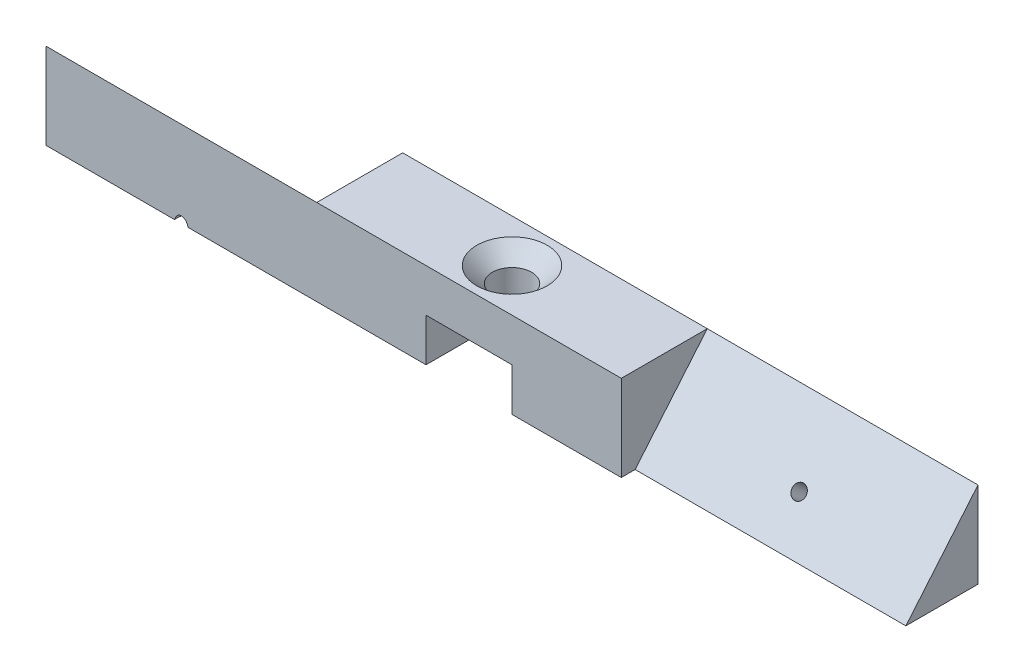
ISO-10303-21;
HEADER;
FILE_DESCRIPTION(('STEP AP214'),'2;1');
FILE_NAME('part.step','',(''),(''),'','','');
FILE_SCHEMA(('AUTOMOTIVE_DESIGN { 1 0 10303 214 1 1 1 1 }'));
ENDSEC;
DATA;
#1=APPLICATION_CONTEXT('core data for automotive mechanical design processes');
#2=APPLICATION_PROTOCOL_DEFINITION('international standard','automotive_design',2000,#1);
#3=PRODUCT_CONTEXT('',#1,'mechanical');
#4=PRODUCT('Part','Part','',(#3));
#5=PRODUCT_RELATED_PRODUCT_CATEGORY('part','',(#4));
#6=PRODUCT_DEFINITION_FORMATION('','',#4);
#7=PRODUCT_DEFINITION_CONTEXT('part definition',#1,'design');
#8=PRODUCT_DEFINITION('design','',#6,#7);
#9=PRODUCT_DEFINITION_SHAPE('','',#8);
#10=(LENGTH_UNIT() NAMED_UNIT(*) SI_UNIT(.MILLI.,.METRE.));
#11=(NAMED_UNIT(*) PLANE_ANGLE_UNIT() SI_UNIT($,.RADIAN.));
#12=(NAMED_UNIT(*) SI_UNIT($,.STERADIAN.) SOLID_ANGLE_UNIT());
#13=UNCERTAINTY_MEASURE_WITH_UNIT(LENGTH_MEASURE(1.E-05),#10,'distance_accuracy_value','');
#14=(GEOMETRIC_REPRESENTATION_CONTEXT(3) GLOBAL_UNCERTAINTY_ASSIGNED_CONTEXT((#13)) GLOBAL_UNIT_ASSIGNED_CONTEXT((#10,
#11,#12)) REPRESENTATION_CONTEXT('',''));
#15=CARTESIAN_POINT('',(0.,0.,0.));
#16=DIRECTION('',(0.,0.,1.));
#17=DIRECTION('',(1.,0.,0.));
#18=AXIS2_PLACEMENT_3D('',#15,#16,#17);
#19=CARTESIAN_POINT('',(0.,12.7,0.));
#20=DIRECTION('',(0.,1.,0.));
#21=DIRECTION('',(0.,0.,1.));
#22=AXIS2_PLACEMENT_3D('',#19,#20,#21);
#23=PLANE('',#22);
#24=CARTESIAN_POINT('',(0.,12.7,0.));
#25=DIRECTION('',(0.,1.,0.));
#26=DIRECTION('',(0.,0.,1.));
#27=AXIS2_PLACEMENT_3D('',#24,#25,#26);
#28=CIRCLE('',#27,5.2);
#29=CARTESIAN_POINT('',(0.,12.7,5.2));
#30=VERTEX_POINT('',#29);
#31=EDGE_CURVE('E216',#30,#30,#28,.T.);
#32=ORIENTED_EDGE('',*,*,#31,.F.);
#33=EDGE_LOOP('',(#32));
#34=FACE_BOUND('',#33,.T.);
#35=DIRECTION('',(-1.,0.,0.));
#36=VECTOR('',#35,1.);
#37=CARTESIAN_POINT('',(-62.5,12.7,-6.35));
#38=LINE('',#37,#36);
#39=CARTESIAN_POINT('',(22.5,12.7,-6.35));
#40=VERTEX_POINT('',#39);
#41=CARTESIAN_POINT('',(-22.5,12.7,-6.35));
#42=VERTEX_POINT('',#41);
#43=EDGE_CURVE('E160',#40,#42,#38,.T.);
#44=ORIENTED_EDGE('',*,*,#43,.T.);
#45=DIRECTION('',(0.,0.,-1.));
#46=VECTOR('',#45,1.);
#47=CARTESIAN_POINT('',(-22.5,12.7,-6.35));
#48=LINE('',#47,#46);
#49=CARTESIAN_POINT('',(-22.5,12.7,6.34999999999999));
#50=VERTEX_POINT('',#49);
#51=EDGE_CURVE('E189',#50,#42,#48,.T.);
#52=ORIENTED_EDGE('',*,*,#51,.F.);
#53=DIRECTION('',(1.,0.,0.));
#54=VECTOR('',#53,1.);
#55=CARTESIAN_POINT('',(-62.5,12.7,6.35));
#56=LINE('',#55,#54);
#57=CARTESIAN_POINT('',(22.5,12.7,6.35));
#58=VERTEX_POINT('',#57);
#59=EDGE_CURVE('E254',#50,#58,#56,.T.);
#60=ORIENTED_EDGE('',*,*,#59,.T.);
#61=DIRECTION('',(0.,0.,1.));
#62=VECTOR('',#61,1.);
#63=CARTESIAN_POINT('',(22.5,12.7,6.35));
#64=LINE('',#63,#62);
#65=EDGE_CURVE('E202',#40,#58,#64,.T.);
#66=ORIENTED_EDGE('',*,*,#65,.F.);
#67=EDGE_LOOP('',(#44,#52,#60,#66));
#68=FACE_BOUND('',#67,.T.);
#69=ADVANCED_FACE('F48',(#34,#68),#23,.T.);
#70=CARTESIAN_POINT('',(-62.5,12.7,-6.35));
#71=DIRECTION('',(0.,0.,1.));
#72=DIRECTION('',(1.,0.,0.));
#73=AXIS2_PLACEMENT_3D('',#70,#71,#72);
#74=PLANE('',#73);
#75=DIRECTION('',(0.,-1.,0.));
#76=VECTOR('',#75,1.);
#77=CARTESIAN_POINT('',(-22.5,-2.43527062594631,-6.35));
#78=LINE('',#77,#76);
#79=CARTESIAN_POINT('',(-22.5,0.,-6.35));
#80=VERTEX_POINT('',#79);
#81=EDGE_CURVE('E69',#42,#80,#78,.T.);
#82=ORIENTED_EDGE('',*,*,#81,.F.);
#83=ORIENTED_EDGE('',*,*,#43,.F.);
#84=CARTESIAN_POINT('',(62.5,12.7,-6.35));
#85=VERTEX_POINT('',#84);
#86=EDGE_CURVE('E252',#85,#40,#38,.T.);
#87=ORIENTED_EDGE('',*,*,#86,.F.);
#88=DIRECTION('',(0.,-1.,0.));
#89=VECTOR('',#88,1.);
#90=CARTESIAN_POINT('',(62.5,12.7,-6.35));
#91=LINE('',#90,#89);
#92=CARTESIAN_POINT('',(62.5,0.,-6.35));
#93=VERTEX_POINT('',#92);
#94=EDGE_CURVE('E168',#85,#93,#91,.T.);
#95=ORIENTED_EDGE('',*,*,#94,.T.);
#96=DIRECTION('',(-1.,0.,0.));
#97=VECTOR('',#96,1.);
#98=CARTESIAN_POINT('',(-62.5,0.,-6.35));
#99=LINE('',#98,#97);
#100=CARTESIAN_POINT('',(43.4884615643872,0.,-6.35));
#101=VERTEX_POINT('',#100);
#102=EDGE_CURVE('E257',#93,#101,#99,.T.);
#103=ORIENTED_EDGE('',*,*,#102,.T.);
#104=CARTESIAN_POINT('',(42.5,-0.354072893322843,-6.35));
#105=DIRECTION('',(0.,0.,1.));
#106=DIRECTION('',(0.,1.,0.));
#107=AXIS2_PLACEMENT_3D('',#104,#105,#106);
#108=ELLIPSE('',#107,1.33804247156559,1.025);
#109=CARTESIAN_POINT('',(41.5115384356128,0.,-6.35));
#110=VERTEX_POINT('',#109);
#111=EDGE_CURVE('E198',#101,#110,#108,.T.);
#112=ORIENTED_EDGE('',*,*,#111,.T.);
#113=CARTESIAN_POINT('',(6.34999999999998,0.,-6.35));
#114=VERTEX_POINT('',#113);
#115=EDGE_CURVE('E259',#110,#114,#99,.T.);
#116=ORIENTED_EDGE('',*,*,#115,.T.);
#117=DIRECTION('',(0.,-1.,0.));
#118=VECTOR('',#117,1.);
#119=CARTESIAN_POINT('',(6.34999999999998,6.34999999999999,-6.35));
#120=LINE('',#119,#118);
#121=CARTESIAN_POINT('',(6.34999999999998,6.34999999999999,-6.35));
#122=VERTEX_POINT('',#121);
#123=EDGE_CURVE('E241',#122,#114,#120,.T.);
#124=ORIENTED_EDGE('',*,*,#123,.F.);
#125=DIRECTION('',(1.,0.,0.));
#126=VECTOR('',#125,1.);
#127=CARTESIAN_POINT('',(-6.35000000000001,6.34999999999999,-6.35));
#128=LINE('',#127,#126);
#129=CARTESIAN_POINT('',(-6.35000000000001,6.34999999999999,-6.35));
#130=VERTEX_POINT('',#129);
#131=EDGE_CURVE('E235',#130,#122,#128,.T.);
#132=ORIENTED_EDGE('',*,*,#131,.F.);
#133=DIRECTION('',(0.,-1.,0.));
#134=VECTOR('',#133,1.);
#135=CARTESIAN_POINT('',(-6.35000000000001,6.34999999999999,-6.35));
#136=LINE('',#135,#134);
#137=CARTESIAN_POINT('',(-6.35000000000001,0.,-6.35));
#138=VERTEX_POINT('',#137);
#139=EDGE_CURVE('E245',#130,#138,#136,.T.);
#140=ORIENTED_EDGE('',*,*,#139,.T.);
#141=EDGE_CURVE('E256',#138,#80,#99,.T.);
#142=ORIENTED_EDGE('',*,*,#141,.T.);
#143=EDGE_LOOP('',(#82,#83,#87,#95,#103,#112,#116,#124,#132,#140,#142));
#144=FACE_BOUND('',#143,.T.);
#145=ADVANCED_FACE('F262',(#144),#74,.F.);
#146=CARTESIAN_POINT('',(22.5,12.7,-6.35));
#147=DIRECTION('',(0.,-0.642787609686543,-0.766044443118975));
#148=DIRECTION('',(0.,0.766044443118974,-0.642787609686543));
#149=AXIS2_PLACEMENT_3D('',#146,#147,#148);
#150=PLANE('',#149);
#151=DIRECTION('',(0.,0.766044443118974,-0.642787609686543));
#152=VECTOR('',#151,1.);
#153=CARTESIAN_POINT('',(62.5,12.7,-6.35));
#154=LINE('',#153,#152);
#155=CARTESIAN_POINT('',(62.5,0.,4.30656531595157));
#156=VERTEX_POINT('',#155);
#157=EDGE_CURVE('E201',#156,#85,#154,.T.);
#158=ORIENTED_EDGE('',*,*,#157,.T.);
#159=ORIENTED_EDGE('',*,*,#86,.T.);
#160=DIRECTION('',(0.,0.766044443118974,-0.642787609686543));
#161=VECTOR('',#160,1.);
#162=CARTESIAN_POINT('',(22.5,12.7,-6.35));
#163=LINE('',#162,#161);
#164=CARTESIAN_POINT('',(22.5,0.,4.30656531595157));
#165=VERTEX_POINT('',#164);
#166=EDGE_CURVE('E207',#165,#40,#163,.T.);
#167=ORIENTED_EDGE('',*,*,#166,.F.);
#168=DIRECTION('',(-1.,0.,0.));
#169=VECTOR('',#168,1.);
#170=CARTESIAN_POINT('',(0.,0.,4.30656531595157));
#171=LINE('',#170,#169);
#172=EDGE_CURVE('E213',#156,#165,#171,.T.);
#173=ORIENTED_EDGE('',*,*,#172,.F.);
#174=EDGE_LOOP('',(#158,#159,#167,#173));
#175=FACE_BOUND('',#174,.T.);
#176=CARTESIAN_POINT('',(42.5,5.03955556881025,0.0778760968654299));
#177=DIRECTION('',(0.,0.642787609686543,0.766044443118975));
#178=DIRECTION('',(0.,-0.766044443118974,0.642787609686543));
#179=AXIS2_PLACEMENT_3D('',#176,#177,#178);
#180=CIRCLE('',#179,1.025);
#181=CARTESIAN_POINT('',(42.5,4.2543600146133,0.736733396794136));
#182=VERTEX_POINT('',#181);
#183=EDGE_CURVE('E195',#182,#182,#180,.T.);
#184=ORIENTED_EDGE('',*,*,#183,.F.);
#185=EDGE_LOOP('',(#184));
#186=FACE_BOUND('',#185,.T.);
#187=ADVANCED_FACE('F286',(#175,#186),#150,.F.);
#188=CARTESIAN_POINT('',(-62.5,12.7,6.35));
#189=DIRECTION('',(0.,0.,-1.));
#190=DIRECTION('',(-1.,0.,0.));
#191=AXIS2_PLACEMENT_3D('',#188,#189,#190);
#192=PLANE('',#191);
#193=DIRECTION('',(1.,0.,0.));
#194=VECTOR('',#193,1.);
#195=CARTESIAN_POINT('',(-62.5,0.,6.35));
#196=LINE('',#195,#194);
#197=CARTESIAN_POINT('',(-62.5,0.,6.35));
#198=VERTEX_POINT('',#197);
#199=CARTESIAN_POINT('',(-43.4884615643872,0.,6.35));
#200=VERTEX_POINT('',#199);
#201=EDGE_CURVE('E150',#198,#200,#196,.T.);
#202=ORIENTED_EDGE('',*,*,#201,.T.);
#203=CARTESIAN_POINT('',(-42.5,-0.354072893322843,6.35));
#204=DIRECTION('',(0.,0.,-1.));
#205=DIRECTION('',(0.,1.,0.));
#206=AXIS2_PLACEMENT_3D('',#203,#204,#205);
#207=ELLIPSE('',#206,1.33804247156559,1.025);
#208=CARTESIAN_POINT('',(-41.5115384356128,0.,6.35));
#209=VERTEX_POINT('',#208);
#210=EDGE_CURVE('E62',#200,#209,#207,.T.);
#211=ORIENTED_EDGE('',*,*,#210,.T.);
#212=CARTESIAN_POINT('',(-6.35000000000001,0.,6.35));
#213=VERTEX_POINT('',#212);
#214=EDGE_CURVE('E147',#209,#213,#196,.T.);
#215=ORIENTED_EDGE('',*,*,#214,.T.);
#216=DIRECTION('',(0.,-1.,0.));
#217=VECTOR('',#216,1.);
#218=CARTESIAN_POINT('',(-6.34999999999999,6.34999999999999,6.35));
#219=LINE('',#218,#217);
#220=CARTESIAN_POINT('',(-6.34999999999999,6.34999999999999,6.35));
#221=VERTEX_POINT('',#220);
#222=EDGE_CURVE('E248',#221,#213,#219,.T.);
#223=ORIENTED_EDGE('',*,*,#222,.F.);
#224=DIRECTION('',(-1.,0.,0.));
#225=VECTOR('',#224,1.);
#226=CARTESIAN_POINT('',(-6.34999999999999,6.34999999999999,6.35));
#227=LINE('',#226,#225);
#228=CARTESIAN_POINT('',(6.34999999999999,6.34999999999999,6.35000000000001));
#229=VERTEX_POINT('',#228);
#230=EDGE_CURVE('E229',#229,#221,#227,.T.);
#231=ORIENTED_EDGE('',*,*,#230,.F.);
#232=DIRECTION('',(0.,-1.,0.));
#233=VECTOR('',#232,1.);
#234=CARTESIAN_POINT('',(6.34999999999999,6.34999999999999,6.35000000000001));
#235=LINE('',#234,#233);
#236=CARTESIAN_POINT('',(6.34999999999999,0.,6.35000000000001));
#237=VERTEX_POINT('',#236);
#238=EDGE_CURVE('E238',#229,#237,#235,.T.);
#239=ORIENTED_EDGE('',*,*,#238,.T.);
#240=CARTESIAN_POINT('',(22.5,0.,6.35));
#241=VERTEX_POINT('',#240);
#242=EDGE_CURVE('E158',#237,#241,#196,.T.);
#243=ORIENTED_EDGE('',*,*,#242,.T.);
#244=DIRECTION('',(0.,-1.,0.));
#245=VECTOR('',#244,1.);
#246=CARTESIAN_POINT('',(22.5,-2.43527062594631,6.35));
#247=LINE('',#246,#245);
#248=EDGE_CURVE('E205',#58,#241,#247,.T.);
#249=ORIENTED_EDGE('',*,*,#248,.F.);
#250=ORIENTED_EDGE('',*,*,#59,.F.);
#251=CARTESIAN_POINT('',(-62.5,12.7,6.35));
#252=VERTEX_POINT('',#251);
#253=EDGE_CURVE('E169',#252,#50,#56,.T.);
#254=ORIENTED_EDGE('',*,*,#253,.F.);
#255=DIRECTION('',(0.,-1.,0.));
#256=VECTOR('',#255,1.);
#257=CARTESIAN_POINT('',(-62.5,12.7,6.35));
#258=LINE('',#257,#256);
#259=EDGE_CURVE('E166',#252,#198,#258,.T.);
#260=ORIENTED_EDGE('',*,*,#259,.T.);
#261=EDGE_LOOP('',(#202,#211,#215,#223,#231,#239,#243,#249,#250,#254,#260));
#262=FACE_BOUND('',#261,.T.);
#263=ADVANCED_FACE('F145',(#262),#192,.F.);
#264=CARTESIAN_POINT('',(0.,0.,0.));
#265=DIRECTION('',(0.,1.,0.));
#266=DIRECTION('',(0.,0.,1.));
#267=AXIS2_PLACEMENT_3D('',#264,#265,#266);
#268=PLANE('',#267);
#269=ORIENTED_EDGE('',*,*,#115,.F.);
#270=CARTESIAN_POINT('',(42.5,0.,-5.92803235734228));
#271=DIRECTION('',(0.,1.,0.));
#272=DIRECTION('',(0.,0.,1.));
#273=AXIS2_PLACEMENT_3D('',#270,#271,#272);
#274=ELLIPSE('',#273,1.59461692253191,1.025);
#275=EDGE_CURVE('E172',#110,#101,#274,.T.);
#276=ORIENTED_EDGE('',*,*,#275,.T.);
#277=ORIENTED_EDGE('',*,*,#102,.F.);
#278=DIRECTION('',(0.,0.,-1.));
#279=VECTOR('',#278,1.);
#280=CARTESIAN_POINT('',(62.5,0.,-6.35));
#281=LINE('',#280,#279);
#282=EDGE_CURVE('E244',#156,#93,#281,.T.);
#283=ORIENTED_EDGE('',*,*,#282,.F.);
#284=ORIENTED_EDGE('',*,*,#172,.T.);
#285=DIRECTION('',(0.,0.,-1.));
#286=VECTOR('',#285,1.);
#287=CARTESIAN_POINT('',(22.5,0.,0.));
#288=LINE('',#287,#286);
#289=EDGE_CURVE('E210',#241,#165,#288,.T.);
#290=ORIENTED_EDGE('',*,*,#289,.F.);
#291=ORIENTED_EDGE('',*,*,#242,.F.);
#292=DIRECTION('',(0.,0.,1.));
#293=VECTOR('',#292,1.);
#294=CARTESIAN_POINT('',(6.34999999999998,0.,-6.35));
#295=LINE('',#294,#293);
#296=EDGE_CURVE('E225',#114,#237,#295,.T.);
#297=ORIENTED_EDGE('',*,*,#296,.F.);
#298=EDGE_LOOP('',(#269,#276,#277,#283,#284,#290,#291,#297));
#299=FACE_BOUND('',#298,.T.);
#300=ADVANCED_FACE('F279',(#299),#268,.F.);
#301=CARTESIAN_POINT('',(62.5,12.7,-6.35));
#302=DIRECTION('',(-1.,0.,0.));
#303=DIRECTION('',(0.,0.,1.));
#304=AXIS2_PLACEMENT_3D('',#301,#302,#303);
#305=PLANE('',#304);
#306=ORIENTED_EDGE('',*,*,#94,.F.);
#307=ORIENTED_EDGE('',*,*,#157,.F.);
#308=ORIENTED_EDGE('',*,*,#282,.T.);
#309=EDGE_LOOP('',(#306,#307,#308));
#310=FACE_BOUND('',#309,.T.);
#311=ADVANCED_FACE('F50',(#310),#305,.F.);
#312=CARTESIAN_POINT('',(-62.5,12.7,-6.35));
#313=DIRECTION('',(1.,0.,0.));
#314=DIRECTION('',(0.,0.,-1.));
#315=AXIS2_PLACEMENT_3D('',#312,#313,#314);
#316=PLANE('',#315);
#317=ORIENTED_EDGE('',*,*,#259,.F.);
#318=DIRECTION('',(0.,0.766044443118974,0.642787609686543));
#319=VECTOR('',#318,1.);
#320=CARTESIAN_POINT('',(-62.5,12.7,6.35));
#321=LINE('',#320,#319);
#322=CARTESIAN_POINT('',(-62.5,0.,-4.30656531595157));
#323=VERTEX_POINT('',#322);
#324=EDGE_CURVE('E151',#323,#252,#321,.T.);
#325=ORIENTED_EDGE('',*,*,#324,.F.);
#326=DIRECTION('',(0.,0.,1.));
#327=VECTOR('',#326,1.);
#328=CARTESIAN_POINT('',(-62.5,0.,-6.35));
#329=LINE('',#328,#327);
#330=EDGE_CURVE('E162',#323,#198,#329,.T.);
#331=ORIENTED_EDGE('',*,*,#330,.T.);
#332=EDGE_LOOP('',(#317,#325,#331));
#333=FACE_BOUND('',#332,.T.);
#334=ADVANCED_FACE('F187',(#333),#316,.F.);
#335=ORIENTED_EDGE('',*,*,#214,.F.);
#336=CARTESIAN_POINT('',(-42.5,0.,5.92803235734227));
#337=DIRECTION('',(0.,1.,0.));
#338=DIRECTION('',(0.,0.,-1.));
#339=AXIS2_PLACEMENT_3D('',#336,#337,#338);
#340=ELLIPSE('',#339,1.59461692253191,1.025);
#341=EDGE_CURVE('E13',#209,#200,#340,.T.);
#342=ORIENTED_EDGE('',*,*,#341,.T.);
#343=ORIENTED_EDGE('',*,*,#201,.F.);
#344=ORIENTED_EDGE('',*,*,#330,.F.);
#345=DIRECTION('',(1.,0.,0.));
#346=VECTOR('',#345,1.);
#347=CARTESIAN_POINT('',(0.,0.,-4.30656531595157));
#348=LINE('',#347,#346);
#349=CARTESIAN_POINT('',(-22.5,0.,-4.30656531595158));
#350=VERTEX_POINT('',#349);
#351=EDGE_CURVE('E56',#323,#350,#348,.T.);
#352=ORIENTED_EDGE('',*,*,#351,.T.);
#353=DIRECTION('',(0.,0.,1.));
#354=VECTOR('',#353,1.);
#355=CARTESIAN_POINT('',(-22.5,0.,0.));
#356=LINE('',#355,#354);
#357=EDGE_CURVE('E175',#80,#350,#356,.T.);
#358=ORIENTED_EDGE('',*,*,#357,.F.);
#359=ORIENTED_EDGE('',*,*,#141,.F.);
#360=DIRECTION('',(0.,0.,-1.));
#361=VECTOR('',#360,1.);
#362=CARTESIAN_POINT('',(-6.35000000000001,0.,-6.35));
#363=LINE('',#362,#361);
#364=EDGE_CURVE('E157',#213,#138,#363,.T.);
#365=ORIENTED_EDGE('',*,*,#364,.F.);
#366=EDGE_LOOP('',(#335,#342,#343,#344,#352,#358,#359,#365));
#367=FACE_BOUND('',#366,.T.);
#368=ADVANCED_FACE('F155',(#367),#268,.F.);
#369=CARTESIAN_POINT('',(6.34999999999998,6.34999999999999,-6.35));
#370=DIRECTION('',(1.,0.,0.));
#371=DIRECTION('',(0.,0.,-1.));
#372=AXIS2_PLACEMENT_3D('',#369,#370,#371);
#373=PLANE('',#372);
#374=ORIENTED_EDGE('',*,*,#296,.T.);
#375=ORIENTED_EDGE('',*,*,#238,.F.);
#376=DIRECTION('',(0.,0.,1.));
#377=VECTOR('',#376,1.);
#378=CARTESIAN_POINT('',(6.34999999999998,6.34999999999999,-6.35));
#379=LINE('',#378,#377);
#380=EDGE_CURVE('E226',#122,#229,#379,.T.);
#381=ORIENTED_EDGE('',*,*,#380,.F.);
#382=ORIENTED_EDGE('',*,*,#123,.T.);
#383=EDGE_LOOP('',(#374,#375,#381,#382));
#384=FACE_BOUND('',#383,.T.);
#385=ADVANCED_FACE('F294',(#384),#373,.F.);
#386=CARTESIAN_POINT('',(-6.35000000000001,6.34999999999999,-6.35));
#387=DIRECTION('',(-1.,0.,0.));
#388=DIRECTION('',(0.,0.,1.));
#389=AXIS2_PLACEMENT_3D('',#386,#387,#388);
#390=PLANE('',#389);
#391=ORIENTED_EDGE('',*,*,#364,.T.);
#392=ORIENTED_EDGE('',*,*,#139,.F.);
#393=DIRECTION('',(0.,0.,-1.));
#394=VECTOR('',#393,1.);
#395=CARTESIAN_POINT('',(-6.35000000000001,6.34999999999999,-6.35));
#396=LINE('',#395,#394);
#397=EDGE_CURVE('E232',#221,#130,#396,.T.);
#398=ORIENTED_EDGE('',*,*,#397,.F.);
#399=ORIENTED_EDGE('',*,*,#222,.T.);
#400=EDGE_LOOP('',(#391,#392,#398,#399));
#401=FACE_BOUND('',#400,.T.);
#402=ADVANCED_FACE('F268',(#401),#390,.F.);
#403=CARTESIAN_POINT('',(0.,6.34999999999999,0.));
#404=DIRECTION('',(0.,1.,0.));
#405=DIRECTION('',(0.,0.,1.));
#406=AXIS2_PLACEMENT_3D('',#403,#404,#405);
#407=PLANE('',#406);
#408=CARTESIAN_POINT('',(0.,6.34999999999999,0.));
#409=DIRECTION('',(0.,1.,0.));
#410=DIRECTION('',(0.,0.,1.));
#411=AXIS2_PLACEMENT_3D('',#408,#409,#410);
#412=CIRCLE('',#411,2.9);
#413=CARTESIAN_POINT('',(0.,6.34999999999999,2.9));
#414=VERTEX_POINT('',#413);
#415=EDGE_CURVE('E222',#414,#414,#412,.T.);
#416=ORIENTED_EDGE('',*,*,#415,.T.);
#417=EDGE_LOOP('',(#416));
#418=FACE_BOUND('',#417,.T.);
#419=ORIENTED_EDGE('',*,*,#380,.T.);
#420=ORIENTED_EDGE('',*,*,#230,.T.);
#421=ORIENTED_EDGE('',*,*,#397,.T.);
#422=ORIENTED_EDGE('',*,*,#131,.T.);
#423=EDGE_LOOP('',(#419,#420,#421,#422));
#424=FACE_BOUND('',#423,.T.);
#425=ADVANCED_FACE('F270',(#418,#424),#407,.F.);
#426=CARTESIAN_POINT('',(0.,12.7,0.));
#427=DIRECTION('',(0.,1.,0.));
#428=DIRECTION('',(0.,0.,1.));
#429=AXIS2_PLACEMENT_3D('',#426,#427,#428);
#430=CYLINDRICAL_SURFACE('',#429,2.9);
#431=CARTESIAN_POINT('',(0.,10.4,0.));
#432=DIRECTION('',(0.,1.,0.));
#433=DIRECTION('',(0.,0.,1.));
#434=AXIS2_PLACEMENT_3D('',#431,#432,#433);
#435=CIRCLE('',#434,2.9);
#436=CARTESIAN_POINT('',(0.,10.4,2.9));
#437=VERTEX_POINT('',#436);
#438=EDGE_CURVE('E219',#437,#437,#435,.T.);
#439=CARTESIAN_POINT('',(0.,6.34999999999999,2.9));
#440=CARTESIAN_POINT('',(0.,6.39218749999999,2.9));
#441=CARTESIAN_POINT('',(0.,6.43437499999999,2.9));
#442=CARTESIAN_POINT('',(0.,6.51874999999999,2.9));
#443=CARTESIAN_POINT('',(0.,6.56093749999999,2.9));
#444=CARTESIAN_POINT('',(0.,6.64531249999999,2.9));
#445=CARTESIAN_POINT('',(0.,6.68749999999999,2.9));
#446=CARTESIAN_POINT('',(0.,6.77187499999999,2.9));
#447=CARTESIAN_POINT('',(0.,6.81406249999999,2.9));
#448=CARTESIAN_POINT('',(0.,6.89843749999999,2.9));
#449=CARTESIAN_POINT('',(0.,6.94062499999999,2.9));
#450=CARTESIAN_POINT('',(0.,7.02499999999999,2.9));
#451=CARTESIAN_POINT('',(0.,7.06718749999999,2.9));
#452=CARTESIAN_POINT('',(0.,7.15156249999999,2.9));
#453=CARTESIAN_POINT('',(0.,7.19374999999999,2.9));
#454=CARTESIAN_POINT('',(0.,7.27812499999999,2.9));
#455=CARTESIAN_POINT('',(0.,7.32031249999999,2.9));
#456=CARTESIAN_POINT('',(0.,7.40468749999999,2.9));
#457=CARTESIAN_POINT('',(0.,7.44687499999999,2.9));
#458=CARTESIAN_POINT('',(0.,7.53124999999999,2.9));
#459=CARTESIAN_POINT('',(0.,7.57343749999999,2.9));
#460=CARTESIAN_POINT('',(0.,7.65781249999999,2.9));
#461=CARTESIAN_POINT('',(0.,7.69999999999999,2.9));
#462=CARTESIAN_POINT('',(0.,7.78437499999999,2.9));
#463=CARTESIAN_POINT('',(0.,7.82656249999999,2.9));
#464=CARTESIAN_POINT('',(0.,7.91093749999999,2.9));
#465=CARTESIAN_POINT('',(0.,7.95312499999999,2.9));
#466=CARTESIAN_POINT('',(0.,8.03749999999999,2.9));
#467=CARTESIAN_POINT('',(0.,8.07968749999999,2.9));
#468=CARTESIAN_POINT('',(0.,8.16406249999999,2.9));
#469=CARTESIAN_POINT('',(0.,8.20624999999999,2.9));
#470=CARTESIAN_POINT('',(0.,8.290625,2.9));
#471=CARTESIAN_POINT('',(0.,8.33281249999999,2.9));
#472=CARTESIAN_POINT('',(0.,8.41718749999999,2.9));
#473=CARTESIAN_POINT('',(0.,8.45937499999999,2.9));
#474=CARTESIAN_POINT('',(0.,8.54374999999999,2.9));
#475=CARTESIAN_POINT('',(0.,8.58593749999999,2.9));
#476=CARTESIAN_POINT('',(0.,8.67031249999999,2.9));
#477=CARTESIAN_POINT('',(0.,8.71249999999999,2.9));
#478=CARTESIAN_POINT('',(0.,8.79687499999999,2.9));
#479=CARTESIAN_POINT('',(0.,8.83906249999999,2.9));
#480=CARTESIAN_POINT('',(0.,8.92343749999999,2.9));
#481=CARTESIAN_POINT('',(0.,8.96562499999999,2.9));
#482=CARTESIAN_POINT('',(0.,9.04999999999999,2.9));
#483=CARTESIAN_POINT('',(0.,9.09218749999999,2.9));
#484=CARTESIAN_POINT('',(0.,9.17656249999999,2.9));
#485=CARTESIAN_POINT('',(0.,9.21874999999999,2.9));
#486=CARTESIAN_POINT('',(0.,9.30312499999999,2.9));
#487=CARTESIAN_POINT('',(0.,9.34531249999999,2.9));
#488=CARTESIAN_POINT('',(0.,9.42968749999999,2.9));
#489=CARTESIAN_POINT('',(0.,9.47187499999999,2.9));
#490=CARTESIAN_POINT('',(0.,9.55624999999999,2.9));
#491=CARTESIAN_POINT('',(0.,9.59843749999999,2.9));
#492=CARTESIAN_POINT('',(0.,9.68281249999999,2.9));
#493=CARTESIAN_POINT('',(0.,9.72499999999999,2.9));
#494=CARTESIAN_POINT('',(0.,9.80937499999999,2.9));
#495=CARTESIAN_POINT('',(0.,9.85156249999999,2.9));
#496=CARTESIAN_POINT('',(0.,9.93593749999999,2.9));
#497=CARTESIAN_POINT('',(0.,9.97812499999999,2.9));
#498=CARTESIAN_POINT('',(0.,10.0625,2.9));
#499=CARTESIAN_POINT('',(0.,10.1046875,2.9));
#500=CARTESIAN_POINT('',(0.,10.1890625,2.9));
#501=CARTESIAN_POINT('',(0.,10.23125,2.9));
#502=CARTESIAN_POINT('',(0.,10.315625,2.9));
#503=CARTESIAN_POINT('',(0.,10.3578125,2.9));
#504=CARTESIAN_POINT('',(0.,10.4,2.9));
#505=B_SPLINE_CURVE_WITH_KNOTS('',3,(#439,#440,#441,#442,#443,#444,#445,#446,#447,#448,#449,
#450,#451,#452,#453,#454,#455,#456,#457,#458,#459,#460,#461,#462,#463,#464,#465,#466,#467,#468,
#469,#470,#471,#472,#473,#474,#475,#476,#477,#478,#479,#480,#481,#482,#483,#484,#485,#486,#487,
#488,#489,#490,#491,#492,#493,#494,#495,#496,#497,#498,#499,#500,#501,#502,#503,#504),
.UNSPECIFIED.,.F.,.F.,(4,2,2,2,2,2,2,2,2,2,2,2,2,2,2,2,2,2,2,2,2,2,2,2,2,2,2,2,2,2,2,2,4),(0.,
0.1265625,0.253125,0.3796875,0.50625,0.6328125,0.759375,0.8859375,1.0125,1.1390625,1.265625,
1.3921875,1.51875,1.6453125,1.771875,1.8984375,2.025,2.1515625,2.278125,2.4046875,2.53125,
2.6578125,2.784375,2.9109375,3.0375,3.1640625,3.290625,3.4171875,3.54375,3.6703125,3.796875,
3.9234375,4.05),.UNSPECIFIED.);
#506=EDGE_CURVE('BSEAM390',#414,#437,#505,.T.);
#507=ORIENTED_EDGE('',*,*,#415,.F.);
#508=ORIENTED_EDGE('',*,*,#438,.T.);
#509=ORIENTED_EDGE('',*,*,#506,.T.);
#510=ORIENTED_EDGE('',*,*,#506,.F.);
#511=EDGE_LOOP('',(#507,#509,#508,#510));
#512=FACE_BOUND('',#511,.T.);
#513=ADVANCED_FACE('F390',(#512),#430,.F.);
#514=CARTESIAN_POINT('',(0.,12.7,0.));
#515=DIRECTION('',(0.,1.,0.));
#516=DIRECTION('',(0.,0.,1.));
#517=AXIS2_PLACEMENT_3D('',#514,#515,#516);
#518=CONICAL_SURFACE('',#517,5.2,0.785398163397448);
#519=CARTESIAN_POINT('',(0.,10.4,2.9));
#520=CARTESIAN_POINT('',(0.,10.4239583333333,2.92395833333333));
#521=CARTESIAN_POINT('',(0.,10.4479166666667,2.94791666666667));
#522=CARTESIAN_POINT('',(0.,10.4958333333333,2.99583333333333));
#523=CARTESIAN_POINT('',(0.,10.5197916666667,3.01979166666667));
#524=CARTESIAN_POINT('',(0.,10.5677083333333,3.06770833333333));
#525=CARTESIAN_POINT('',(0.,10.5916666666667,3.09166666666667));
#526=CARTESIAN_POINT('',(0.,10.6395833333333,3.13958333333333));
#527=CARTESIAN_POINT('',(0.,10.6635416666667,3.16354166666667));
#528=CARTESIAN_POINT('',(0.,10.7114583333333,3.21145833333333));
#529=CARTESIAN_POINT('',(0.,10.7354166666667,3.23541666666667));
#530=CARTESIAN_POINT('',(0.,10.7833333333333,3.28333333333333));
#531=CARTESIAN_POINT('',(0.,10.8072916666667,3.30729166666667));
#532=CARTESIAN_POINT('',(0.,10.8552083333333,3.35520833333333));
#533=CARTESIAN_POINT('',(0.,10.8791666666667,3.37916666666667));
#534=CARTESIAN_POINT('',(0.,10.9270833333333,3.42708333333333));
#535=CARTESIAN_POINT('',(0.,10.9510416666667,3.45104166666667));
#536=CARTESIAN_POINT('',(0.,10.9989583333333,3.49895833333333));
#537=CARTESIAN_POINT('',(0.,11.0229166666667,3.52291666666667));
#538=CARTESIAN_POINT('',(0.,11.0708333333333,3.57083333333333));
#539=CARTESIAN_POINT('',(0.,11.0947916666667,3.59479166666667));
#540=CARTESIAN_POINT('',(0.,11.1427083333333,3.64270833333333));
#541=CARTESIAN_POINT('',(0.,11.1666666666667,3.66666666666667));
#542=CARTESIAN_POINT('',(0.,11.2145833333333,3.71458333333333));
#543=CARTESIAN_POINT('',(0.,11.2385416666667,3.73854166666667));
#544=CARTESIAN_POINT('',(0.,11.2864583333333,3.78645833333333));
#545=CARTESIAN_POINT('',(0.,11.3104166666667,3.81041666666667));
#546=CARTESIAN_POINT('',(0.,11.3583333333333,3.85833333333333));
#547=CARTESIAN_POINT('',(0.,11.3822916666667,3.88229166666667));
#548=CARTESIAN_POINT('',(0.,11.4302083333333,3.93020833333333));
#549=CARTESIAN_POINT('',(0.,11.4541666666667,3.95416666666667));
#550=CARTESIAN_POINT('',(0.,11.5020833333333,4.00208333333333));
#551=CARTESIAN_POINT('',(0.,11.5260416666667,4.02604166666667));
#552=CARTESIAN_POINT('',(0.,11.5739583333333,4.07395833333333));
#553=CARTESIAN_POINT('',(0.,11.5979166666667,4.09791666666667));
#554=CARTESIAN_POINT('',(0.,11.6458333333333,4.14583333333333));
#555=CARTESIAN_POINT('',(0.,11.6697916666667,4.16979166666667));
#556=CARTESIAN_POINT('',(0.,11.7177083333333,4.21770833333333));
#557=CARTESIAN_POINT('',(0.,11.7416666666667,4.24166666666667));
#558=CARTESIAN_POINT('',(0.,11.7895833333333,4.28958333333333));
#559=CARTESIAN_POINT('',(0.,11.8135416666667,4.31354166666667));
#560=CARTESIAN_POINT('',(0.,11.8614583333333,4.36145833333333));
#561=CARTESIAN_POINT('',(0.,11.8854166666667,4.38541666666667));
#562=CARTESIAN_POINT('',(0.,11.9333333333333,4.43333333333333));
#563=CARTESIAN_POINT('',(0.,11.9572916666667,4.45729166666667));
#564=CARTESIAN_POINT('',(0.,12.0052083333333,4.50520833333333));
#565=CARTESIAN_POINT('',(0.,12.0291666666667,4.52916666666667));
#566=CARTESIAN_POINT('',(0.,12.0770833333333,4.57708333333333));
#567=CARTESIAN_POINT('',(0.,12.1010416666667,4.60104166666667));
#568=CARTESIAN_POINT('',(0.,12.1489583333333,4.64895833333333));
#569=CARTESIAN_POINT('',(0.,12.1729166666667,4.67291666666667));
#570=CARTESIAN_POINT('',(0.,12.2208333333333,4.72083333333333));
#571=CARTESIAN_POINT('',(0.,12.2447916666667,4.74479166666667));
#572=CARTESIAN_POINT('',(0.,12.2927083333333,4.79270833333333));
#573=CARTESIAN_POINT('',(0.,12.3166666666667,4.81666666666667));
#574=CARTESIAN_POINT('',(0.,12.3645833333333,4.86458333333333));
#575=CARTESIAN_POINT('',(0.,12.3885416666667,4.88854166666667));
#576=CARTESIAN_POINT('',(0.,12.4364583333333,4.93645833333333));
#577=CARTESIAN_POINT('',(0.,12.4604166666667,4.96041666666667));
#578=CARTESIAN_POINT('',(0.,12.5083333333333,5.00833333333333));
#579=CARTESIAN_POINT('',(0.,12.5322916666667,5.03229166666667));
#580=CARTESIAN_POINT('',(0.,12.5802083333333,5.08020833333333));
#581=CARTESIAN_POINT('',(0.,12.6041666666667,5.10416666666667));
#582=CARTESIAN_POINT('',(0.,12.6520833333333,5.15208333333333));
#583=CARTESIAN_POINT('',(0.,12.6760416666667,5.17604166666667));
#584=CARTESIAN_POINT('',(0.,12.7,5.2));
#585=B_SPLINE_CURVE_WITH_KNOTS('',3,(#519,#520,#521,#522,#523,#524,#525,#526,#527,#528,#529,
#530,#531,#532,#533,#534,#535,#536,#537,#538,#539,#540,#541,#542,#543,#544,#545,#546,#547,#548,
#549,#550,#551,#552,#553,#554,#555,#556,#557,#558,#559,#560,#561,#562,#563,#564,#565,#566,#567,
#568,#569,#570,#571,#572,#573,#574,#575,#576,#577,#578,#579,#580,#581,#582,#583,#584),
.UNSPECIFIED.,.F.,.F.,(4,2,2,2,2,2,2,2,2,2,2,2,2,2,2,2,2,2,2,2,2,2,2,2,2,2,2,2,2,2,2,2,4),(0.,
0.101646599795565,0.203293199591131,0.304939799386698,0.406586399182264,0.50823299897783,
0.609879598773397,0.711526198568962,0.813172798364529,0.914819398160094,1.01646599795566,
1.11811259775123,1.21975919754679,1.32140579734236,1.42305239713793,1.52469899693349,
1.62634559672906,1.72799219652462,1.82963879632019,1.93128539611575,2.03293199591132,
2.13457859570689,2.23622519550245,2.33787179529802,2.43951839509359,2.54116499488915,
2.64281159468472,2.74445819448028,2.84610479427585,2.94775139407142,3.04939799386698,
3.15104459366255,3.25269119345812),.UNSPECIFIED.);
#586=EDGE_CURVE('BSEAM383',#437,#30,#585,.T.);
#587=ORIENTED_EDGE('',*,*,#438,.F.);
#588=ORIENTED_EDGE('',*,*,#31,.T.);
#589=ORIENTED_EDGE('',*,*,#586,.T.);
#590=ORIENTED_EDGE('',*,*,#586,.F.);
#591=EDGE_LOOP('',(#587,#589,#588,#590));
#592=FACE_BOUND('',#591,.T.);
#593=ADVANCED_FACE('F383',(#592),#518,.F.);
#594=CARTESIAN_POINT('',(22.5,0.,0.));
#595=DIRECTION('',(1.,0.,0.));
#596=DIRECTION('',(0.,0.,-1.));
#597=AXIS2_PLACEMENT_3D('',#594,#595,#596);
#598=PLANE('',#597);
#599=ORIENTED_EDGE('',*,*,#289,.T.);
#600=ORIENTED_EDGE('',*,*,#166,.T.);
#601=ORIENTED_EDGE('',*,*,#65,.T.);
#602=ORIENTED_EDGE('',*,*,#248,.T.);
#603=EDGE_LOOP('',(#599,#600,#601,#602));
#604=FACE_BOUND('',#603,.T.);
#605=ADVANCED_FACE('F283',(#604),#598,.T.);
#606=CARTESIAN_POINT('',(42.5,5.03955556881025,0.0778760968654299));
#607=DIRECTION('',(0.,0.642787609686543,0.766044443118975));
#608=DIRECTION('',(0.,-0.766044443118974,0.642787609686543));
#609=AXIS2_PLACEMENT_3D('',#606,#607,#608);
#610=CYLINDRICAL_SURFACE('',#609,1.025);
#611=ORIENTED_EDGE('',*,*,#183,.T.);
#612=EDGE_LOOP('',(#611));
#613=FACE_BOUND('',#612,.T.);
#614=ORIENTED_EDGE('',*,*,#275,.F.);
#615=ORIENTED_EDGE('',*,*,#111,.F.);
#616=EDGE_LOOP('',(#614,#615));
#617=FACE_BOUND('',#616,.T.);
#618=ADVANCED_FACE('F293',(#613,#617),#610,.F.);
#619=CARTESIAN_POINT('',(-22.5,12.7,6.34999999999999));
#620=DIRECTION('',(0.,-0.642787609686543,0.766044443118975));
#621=DIRECTION('',(0.,-0.766044443118974,-0.642787609686543));
#622=AXIS2_PLACEMENT_3D('',#619,#620,#621);
#623=PLANE('',#622);
#624=CARTESIAN_POINT('',(-42.5,5.03955556881025,-0.0778760968654368));
#625=DIRECTION('',(0.,0.642787609686543,-0.766044443118975));
#626=DIRECTION('',(0.,0.766044443118974,0.642787609686543));
#627=AXIS2_PLACEMENT_3D('',#624,#625,#626);
#628=CIRCLE('',#627,1.025);
#629=CARTESIAN_POINT('',(-42.5,5.8247511230072,0.580981203063269));
#630=VERTEX_POINT('',#629);
#631=EDGE_CURVE('E152',#630,#630,#628,.T.);
#632=ORIENTED_EDGE('',*,*,#631,.F.);
#633=EDGE_LOOP('',(#632));
#634=FACE_BOUND('',#633,.T.);
#635=ORIENTED_EDGE('',*,*,#324,.T.);
#636=ORIENTED_EDGE('',*,*,#253,.T.);
#637=DIRECTION('',(0.,0.766044443118974,0.642787609686543));
#638=VECTOR('',#637,1.);
#639=CARTESIAN_POINT('',(-22.5,12.7,6.34999999999999));
#640=LINE('',#639,#638);
#641=EDGE_CURVE('E185',#350,#50,#640,.T.);
#642=ORIENTED_EDGE('',*,*,#641,.F.);
#643=ORIENTED_EDGE('',*,*,#351,.F.);
#644=EDGE_LOOP('',(#635,#636,#642,#643));
#645=FACE_BOUND('',#644,.T.);
#646=ADVANCED_FACE('F182',(#634,#645),#623,.F.);
#647=CARTESIAN_POINT('',(-22.5,0.,0.));
#648=DIRECTION('',(-1.,0.,0.));
#649=DIRECTION('',(0.,0.,1.));
#650=AXIS2_PLACEMENT_3D('',#647,#648,#649);
#651=PLANE('',#650);
#652=ORIENTED_EDGE('',*,*,#357,.T.);
#653=ORIENTED_EDGE('',*,*,#641,.T.);
#654=ORIENTED_EDGE('',*,*,#51,.T.);
#655=ORIENTED_EDGE('',*,*,#81,.T.);
#656=EDGE_LOOP('',(#652,#653,#654,#655));
#657=FACE_BOUND('',#656,.T.);
#658=ADVANCED_FACE('F352',(#657),#651,.T.);
#659=CARTESIAN_POINT('',(-42.5,5.03955556881025,-0.0778760968654368));
#660=DIRECTION('',(0.,0.642787609686543,-0.766044443118975));
#661=DIRECTION('',(0.,0.766044443118974,0.642787609686543));
#662=AXIS2_PLACEMENT_3D('',#659,#660,#661);
#663=CYLINDRICAL_SURFACE('',#662,1.025);
#664=ORIENTED_EDGE('',*,*,#631,.T.);
#665=EDGE_LOOP('',(#664));
#666=FACE_BOUND('',#665,.T.);
#667=ORIENTED_EDGE('',*,*,#341,.F.);
#668=ORIENTED_EDGE('',*,*,#210,.F.);
#669=EDGE_LOOP('',(#667,#668));
#670=FACE_BOUND('',#669,.T.);
#671=ADVANCED_FACE('F139',(#666,#670),#663,.F.);
#672=CLOSED_SHELL('',(#69,#145,#187,#263,#300,#311,#334,#368,#385,#402,#425,#513,#593,#605,#618,
#646,#658,#671));
#673=MANIFOLD_SOLID_BREP('B2',#672);
#674=ADVANCED_BREP_SHAPE_REPRESENTATION('',(#18,#673),#14);
#675=SHAPE_DEFINITION_REPRESENTATION(#9,#674);
ENDSEC;
END-ISO-10303-21;
